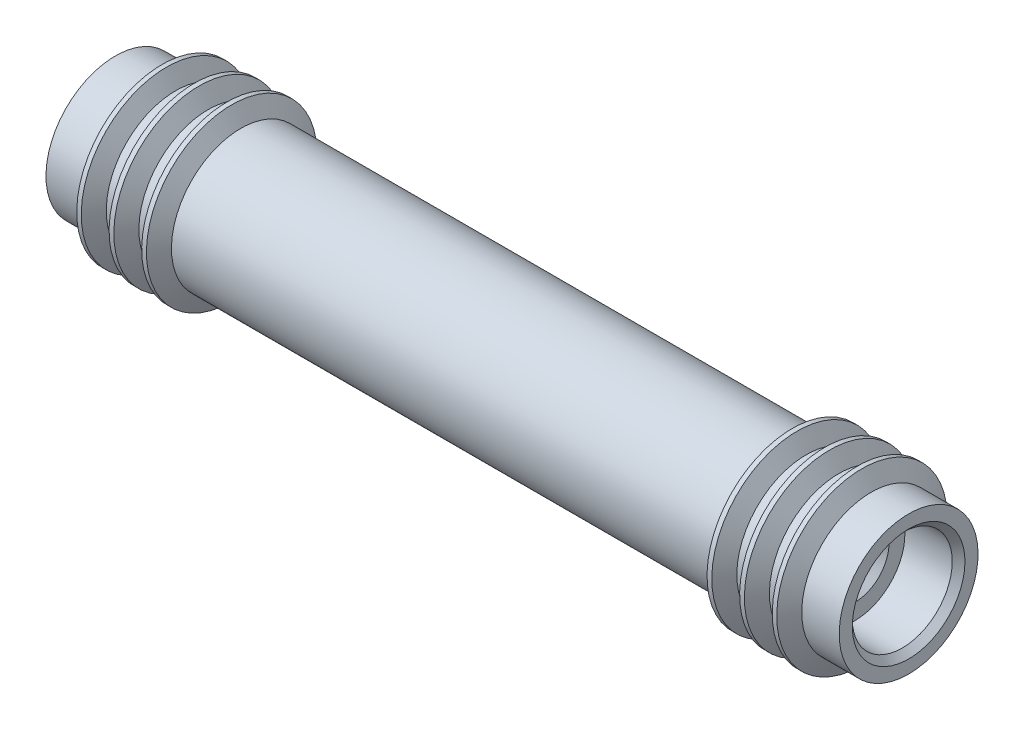
ISO-10303-21;
HEADER;
FILE_DESCRIPTION(('STEP AP214'),'2;1');
FILE_NAME('part.step','',(''),(''),'','','');
FILE_SCHEMA(('AUTOMOTIVE_DESIGN { 1 0 10303 214 1 1 1 1 }'));
ENDSEC;
DATA;
#1=APPLICATION_CONTEXT('core data for automotive mechanical design processes');
#2=APPLICATION_PROTOCOL_DEFINITION('international standard','automotive_design',2000,#1);
#3=PRODUCT_CONTEXT('',#1,'mechanical');
#4=PRODUCT('Part','Part','',(#3));
#5=PRODUCT_RELATED_PRODUCT_CATEGORY('part','',(#4));
#6=PRODUCT_DEFINITION_FORMATION('','',#4);
#7=PRODUCT_DEFINITION_CONTEXT('part definition',#1,'design');
#8=PRODUCT_DEFINITION('design','',#6,#7);
#9=PRODUCT_DEFINITION_SHAPE('','',#8);
#10=(LENGTH_UNIT() NAMED_UNIT(*) SI_UNIT(.MILLI.,.METRE.));
#11=(NAMED_UNIT(*) PLANE_ANGLE_UNIT() SI_UNIT($,.RADIAN.));
#12=(NAMED_UNIT(*) SI_UNIT($,.STERADIAN.) SOLID_ANGLE_UNIT());
#13=UNCERTAINTY_MEASURE_WITH_UNIT(LENGTH_MEASURE(1.E-05),#10,'distance_accuracy_value','');
#14=(GEOMETRIC_REPRESENTATION_CONTEXT(3) GLOBAL_UNCERTAINTY_ASSIGNED_CONTEXT((#13)) GLOBAL_UNIT_ASSIGNED_CONTEXT((#10,
#11,#12)) REPRESENTATION_CONTEXT('',''));
#15=CARTESIAN_POINT('',(0.,0.,0.));
#16=DIRECTION('',(0.,0.,1.));
#17=DIRECTION('',(1.,0.,0.));
#18=AXIS2_PLACEMENT_3D('',#15,#16,#17);
#19=CARTESIAN_POINT('',(-31.75,0.,0.));
#20=DIRECTION('',(-1.,0.,0.));
#21=DIRECTION('',(0.,-1.,0.));
#22=AXIS2_PLACEMENT_3D('',#19,#20,#21);
#23=CYLINDRICAL_SURFACE('',#22,5.55625);
#24=CARTESIAN_POINT('',(-21.7050606325167,0.,0.));
#25=DIRECTION('',(-1.,0.,0.));
#26=DIRECTION('',(0.,-1.,0.));
#27=AXIS2_PLACEMENT_3D('',#24,#25,#26);
#28=CIRCLE('',#27,5.55625);
#29=CARTESIAN_POINT('',(-21.7050606325167,-5.55625,0.));
#30=VERTEX_POINT('',#29);
#31=EDGE_CURVE('E61',#30,#30,#28,.T.);
#32=ORIENTED_EDGE('',*,*,#31,.F.);
#33=EDGE_LOOP('',(#32));
#34=FACE_BOUND('',#33,.T.);
#35=CARTESIAN_POINT('',(21.7050606325167,0.,0.));
#36=DIRECTION('',(-1.,0.,0.));
#37=DIRECTION('',(0.,-1.,0.));
#38=AXIS2_PLACEMENT_3D('',#35,#36,#37);
#39=CIRCLE('',#38,5.55625);
#40=CARTESIAN_POINT('',(21.7050606325167,-5.55625,0.));
#41=VERTEX_POINT('',#40);
#42=EDGE_CURVE('E144',#41,#41,#39,.T.);
#43=ORIENTED_EDGE('',*,*,#42,.T.);
#44=EDGE_LOOP('',(#43));
#45=FACE_BOUND('',#44,.T.);
#46=ADVANCED_FACE('F47',(#34,#45),#23,.T.);
#47=CARTESIAN_POINT('',(-22.4382954743875,0.,0.));
#48=DIRECTION('',(-1.,0.,0.));
#49=DIRECTION('',(0.,-1.,0.));
#50=AXIS2_PLACEMENT_3D('',#47,#48,#49);
#51=CONICAL_SURFACE('',#50,6.82625,1.0471975511966);
#52=ORIENTED_EDGE('',*,*,#31,.T.);
#53=EDGE_LOOP('',(#52));
#54=FACE_BOUND('',#53,.T.);
#55=CARTESIAN_POINT('',(-22.4382954743875,0.,0.));
#56=DIRECTION('',(-1.,0.,0.));
#57=DIRECTION('',(0.,-1.,0.));
#58=AXIS2_PLACEMENT_3D('',#55,#56,#57);
#59=CIRCLE('',#58,6.82625);
#60=CARTESIAN_POINT('',(-22.4382954743875,-6.82625,0.));
#61=VERTEX_POINT('',#60);
#62=EDGE_CURVE('E66',#61,#61,#59,.T.);
#63=ORIENTED_EDGE('',*,*,#62,.F.);
#64=EDGE_LOOP('',(#63));
#65=FACE_BOUND('',#64,.T.);
#66=ADVANCED_FACE('F233',(#54,#65),#51,.T.);
#67=CARTESIAN_POINT('',(-31.75,0.,0.));
#68=DIRECTION('',(-1.,0.,0.));
#69=DIRECTION('',(0.,-1.,0.));
#70=AXIS2_PLACEMENT_3D('',#67,#68,#69);
#71=CYLINDRICAL_SURFACE('',#70,6.82625);
#72=ORIENTED_EDGE('',*,*,#62,.T.);
#73=EDGE_LOOP('',(#72));
#74=FACE_BOUND('',#73,.T.);
#75=CARTESIAN_POINT('',(-22.8192954743875,0.,0.));
#76=DIRECTION('',(-1.,0.,0.));
#77=DIRECTION('',(0.,-1.,0.));
#78=AXIS2_PLACEMENT_3D('',#75,#76,#77);
#79=CIRCLE('',#78,6.82625);
#80=CARTESIAN_POINT('',(-22.8192954743875,-6.82625,0.));
#81=VERTEX_POINT('',#80);
#82=EDGE_CURVE('E72',#81,#81,#79,.T.);
#83=ORIENTED_EDGE('',*,*,#82,.F.);
#84=EDGE_LOOP('',(#83));
#85=FACE_BOUND('',#84,.T.);
#86=ADVANCED_FACE('F240',(#74,#85),#71,.T.);
#87=CARTESIAN_POINT('',(-23.5525303162583,0.,0.));
#88=DIRECTION('',(1.,0.,0.));
#89=DIRECTION('',(0.,1.,0.));
#90=AXIS2_PLACEMENT_3D('',#87,#88,#89);
#91=CONICAL_SURFACE('',#90,5.55625,1.0471975511966);
#92=ORIENTED_EDGE('',*,*,#82,.T.);
#93=EDGE_LOOP('',(#92));
#94=FACE_BOUND('',#93,.T.);
#95=CARTESIAN_POINT('',(-23.5525303162583,0.,0.));
#96=DIRECTION('',(-1.,0.,0.));
#97=DIRECTION('',(0.,-1.,0.));
#98=AXIS2_PLACEMENT_3D('',#95,#96,#97);
#99=CIRCLE('',#98,5.55625);
#100=CARTESIAN_POINT('',(-23.5525303162583,-5.55625,0.));
#101=VERTEX_POINT('',#100);
#102=EDGE_CURVE('E76',#101,#101,#99,.T.);
#103=ORIENTED_EDGE('',*,*,#102,.F.);
#104=EDGE_LOOP('',(#103));
#105=FACE_BOUND('',#104,.T.);
#106=ADVANCED_FACE('F248',(#94,#105),#91,.T.);
#107=CARTESIAN_POINT('',(-31.75,0.,0.));
#108=DIRECTION('',(-1.,0.,0.));
#109=DIRECTION('',(0.,-1.,0.));
#110=AXIS2_PLACEMENT_3D('',#107,#108,#109);
#111=CYLINDRICAL_SURFACE('',#110,5.55625);
#112=ORIENTED_EDGE('',*,*,#102,.T.);
#113=EDGE_LOOP('',(#112));
#114=FACE_BOUND('',#113,.T.);
#115=CARTESIAN_POINT('',(-24.3145303162583,0.,0.));
#116=DIRECTION('',(-1.,0.,0.));
#117=DIRECTION('',(0.,-1.,0.));
#118=AXIS2_PLACEMENT_3D('',#115,#116,#117);
#119=CIRCLE('',#118,5.55625);
#120=CARTESIAN_POINT('',(-24.3145303162583,-5.55625,0.));
#121=VERTEX_POINT('',#120);
#122=EDGE_CURVE('E80',#121,#121,#119,.T.);
#123=ORIENTED_EDGE('',*,*,#122,.F.);
#124=EDGE_LOOP('',(#123));
#125=FACE_BOUND('',#124,.T.);
#126=ADVANCED_FACE('F252',(#114,#125),#111,.T.);
#127=CARTESIAN_POINT('',(-25.0477651581292,0.,0.));
#128=DIRECTION('',(-1.,0.,0.));
#129=DIRECTION('',(0.,-1.,0.));
#130=AXIS2_PLACEMENT_3D('',#127,#128,#129);
#131=CONICAL_SURFACE('',#130,6.82625,1.0471975511966);
#132=ORIENTED_EDGE('',*,*,#122,.T.);
#133=EDGE_LOOP('',(#132));
#134=FACE_BOUND('',#133,.T.);
#135=CARTESIAN_POINT('',(-25.0477651581292,0.,0.));
#136=DIRECTION('',(-1.,0.,0.));
#137=DIRECTION('',(0.,-1.,0.));
#138=AXIS2_PLACEMENT_3D('',#135,#136,#137);
#139=CIRCLE('',#138,6.82625);
#140=CARTESIAN_POINT('',(-25.0477651581292,-6.82625,0.));
#141=VERTEX_POINT('',#140);
#142=EDGE_CURVE('E84',#141,#141,#139,.T.);
#143=ORIENTED_EDGE('',*,*,#142,.F.);
#144=EDGE_LOOP('',(#143));
#145=FACE_BOUND('',#144,.T.);
#146=ADVANCED_FACE('F256',(#134,#145),#131,.T.);
#147=CARTESIAN_POINT('',(-31.75,0.,0.));
#148=DIRECTION('',(-1.,0.,0.));
#149=DIRECTION('',(0.,-1.,0.));
#150=AXIS2_PLACEMENT_3D('',#147,#148,#149);
#151=CYLINDRICAL_SURFACE('',#150,6.82625);
#152=ORIENTED_EDGE('',*,*,#142,.T.);
#153=EDGE_LOOP('',(#152));
#154=FACE_BOUND('',#153,.T.);
#155=CARTESIAN_POINT('',(-25.4287651581292,0.,0.));
#156=DIRECTION('',(-1.,0.,0.));
#157=DIRECTION('',(0.,-1.,0.));
#158=AXIS2_PLACEMENT_3D('',#155,#156,#157);
#159=CIRCLE('',#158,6.82625);
#160=CARTESIAN_POINT('',(-25.4287651581292,-6.82625,0.));
#161=VERTEX_POINT('',#160);
#162=EDGE_CURVE('E88',#161,#161,#159,.T.);
#163=ORIENTED_EDGE('',*,*,#162,.F.);
#164=EDGE_LOOP('',(#163));
#165=FACE_BOUND('',#164,.T.);
#166=ADVANCED_FACE('F260',(#154,#165),#151,.T.);
#167=CARTESIAN_POINT('',(-25.4287651581292,0.,0.));
#168=DIRECTION('',(1.,0.,0.));
#169=DIRECTION('',(0.,1.,0.));
#170=AXIS2_PLACEMENT_3D('',#167,#168,#169);
#171=CONICAL_SURFACE('',#170,6.82625,1.0471975511966);
#172=CARTESIAN_POINT('',(-26.162,0.,0.));
#173=DIRECTION('',(-1.,0.,0.));
#174=DIRECTION('',(0.,-1.,0.));
#175=AXIS2_PLACEMENT_3D('',#172,#173,#174);
#176=CIRCLE('',#175,5.55625);
#177=CARTESIAN_POINT('',(-26.162,-5.55625,0.));
#178=VERTEX_POINT('',#177);
#179=EDGE_CURVE('E92',#178,#178,#176,.T.);
#180=ORIENTED_EDGE('',*,*,#179,.F.);
#181=EDGE_LOOP('',(#180));
#182=FACE_BOUND('',#181,.T.);
#183=ORIENTED_EDGE('',*,*,#162,.T.);
#184=EDGE_LOOP('',(#183));
#185=FACE_BOUND('',#184,.T.);
#186=ADVANCED_FACE('F264',(#182,#185),#171,.T.);
#187=CARTESIAN_POINT('',(-31.75,0.,0.));
#188=DIRECTION('',(-1.,0.,0.));
#189=DIRECTION('',(0.,-1.,0.));
#190=AXIS2_PLACEMENT_3D('',#187,#188,#189);
#191=CYLINDRICAL_SURFACE('',#190,5.55625);
#192=ORIENTED_EDGE('',*,*,#179,.T.);
#193=EDGE_LOOP('',(#192));
#194=FACE_BOUND('',#193,.T.);
#195=CARTESIAN_POINT('',(-26.924,0.,0.));
#196=DIRECTION('',(-1.,0.,0.));
#197=DIRECTION('',(0.,-1.,0.));
#198=AXIS2_PLACEMENT_3D('',#195,#196,#197);
#199=CIRCLE('',#198,5.55625);
#200=CARTESIAN_POINT('',(-26.924,-5.55625,0.));
#201=VERTEX_POINT('',#200);
#202=EDGE_CURVE('E96',#201,#201,#199,.T.);
#203=ORIENTED_EDGE('',*,*,#202,.F.);
#204=EDGE_LOOP('',(#203));
#205=FACE_BOUND('',#204,.T.);
#206=ADVANCED_FACE('F268',(#194,#205),#191,.T.);
#207=CARTESIAN_POINT('',(-27.6572348418708,0.,0.));
#208=DIRECTION('',(-1.,0.,0.));
#209=DIRECTION('',(0.,-1.,0.));
#210=AXIS2_PLACEMENT_3D('',#207,#208,#209);
#211=CONICAL_SURFACE('',#210,6.82625,1.0471975511966);
#212=ORIENTED_EDGE('',*,*,#202,.T.);
#213=EDGE_LOOP('',(#212));
#214=FACE_BOUND('',#213,.T.);
#215=CARTESIAN_POINT('',(-27.6572348418708,0.,0.));
#216=DIRECTION('',(-1.,0.,0.));
#217=DIRECTION('',(0.,-1.,0.));
#218=AXIS2_PLACEMENT_3D('',#215,#216,#217);
#219=CIRCLE('',#218,6.82625);
#220=CARTESIAN_POINT('',(-27.6572348418708,-6.82625,0.));
#221=VERTEX_POINT('',#220);
#222=EDGE_CURVE('E100',#221,#221,#219,.T.);
#223=ORIENTED_EDGE('',*,*,#222,.F.);
#224=EDGE_LOOP('',(#223));
#225=FACE_BOUND('',#224,.T.);
#226=ADVANCED_FACE('F272',(#214,#225),#211,.T.);
#227=CARTESIAN_POINT('',(-31.75,0.,0.));
#228=DIRECTION('',(-1.,0.,0.));
#229=DIRECTION('',(0.,-1.,0.));
#230=AXIS2_PLACEMENT_3D('',#227,#228,#229);
#231=CYLINDRICAL_SURFACE('',#230,6.82625);
#232=ORIENTED_EDGE('',*,*,#222,.T.);
#233=EDGE_LOOP('',(#232));
#234=FACE_BOUND('',#233,.T.);
#235=CARTESIAN_POINT('',(-28.0167651581292,0.,0.));
#236=DIRECTION('',(-1.,0.,0.));
#237=DIRECTION('',(0.,-1.,0.));
#238=AXIS2_PLACEMENT_3D('',#235,#236,#237);
#239=CIRCLE('',#238,6.82625);
#240=CARTESIAN_POINT('',(-28.0167651581292,-6.82625,0.));
#241=VERTEX_POINT('',#240);
#242=EDGE_CURVE('E104',#241,#241,#239,.T.);
#243=ORIENTED_EDGE('',*,*,#242,.F.);
#244=EDGE_LOOP('',(#243));
#245=FACE_BOUND('',#244,.T.);
#246=ADVANCED_FACE('F276',(#234,#245),#231,.T.);
#247=CARTESIAN_POINT('',(-28.75,0.,0.));
#248=DIRECTION('',(1.,0.,0.));
#249=DIRECTION('',(0.,1.,0.));
#250=AXIS2_PLACEMENT_3D('',#247,#248,#249);
#251=CONICAL_SURFACE('',#250,5.55625,1.0471975511966);
#252=ORIENTED_EDGE('',*,*,#242,.T.);
#253=EDGE_LOOP('',(#252));
#254=FACE_BOUND('',#253,.T.);
#255=CARTESIAN_POINT('',(-28.75,0.,0.));
#256=DIRECTION('',(-1.,0.,0.));
#257=DIRECTION('',(0.,-1.,0.));
#258=AXIS2_PLACEMENT_3D('',#255,#256,#257);
#259=CIRCLE('',#258,5.55625);
#260=CARTESIAN_POINT('',(-28.75,-5.55625,0.));
#261=VERTEX_POINT('',#260);
#262=EDGE_CURVE('E108',#261,#261,#259,.T.);
#263=ORIENTED_EDGE('',*,*,#262,.F.);
#264=EDGE_LOOP('',(#263));
#265=FACE_BOUND('',#264,.T.);
#266=ADVANCED_FACE('F280',(#254,#265),#251,.T.);
#267=CARTESIAN_POINT('',(-31.75,0.,0.));
#268=DIRECTION('',(-1.,0.,0.));
#269=DIRECTION('',(0.,-1.,0.));
#270=AXIS2_PLACEMENT_3D('',#267,#268,#269);
#271=CYLINDRICAL_SURFACE('',#270,5.55625);
#272=ORIENTED_EDGE('',*,*,#262,.T.);
#273=EDGE_LOOP('',(#272));
#274=FACE_BOUND('',#273,.T.);
#275=CARTESIAN_POINT('',(-31.75,0.,0.));
#276=DIRECTION('',(-1.,0.,0.));
#277=DIRECTION('',(0.,-1.,0.));
#278=AXIS2_PLACEMENT_3D('',#275,#276,#277);
#279=CIRCLE('',#278,5.55625);
#280=CARTESIAN_POINT('',(-31.75,-5.55625,0.));
#281=VERTEX_POINT('',#280);
#282=EDGE_CURVE('E112',#281,#281,#279,.T.);
#283=ORIENTED_EDGE('',*,*,#282,.F.);
#284=EDGE_LOOP('',(#283));
#285=FACE_BOUND('',#284,.T.);
#286=ADVANCED_FACE('F284',(#274,#285),#271,.T.);
#287=CARTESIAN_POINT('',(-31.75,0.,0.));
#288=DIRECTION('',(1.,0.,0.));
#289=DIRECTION('',(0.,1.,0.));
#290=AXIS2_PLACEMENT_3D('',#287,#288,#289);
#291=PLANE('',#290);
#292=CARTESIAN_POINT('',(-31.75,0.,0.));
#293=DIRECTION('',(1.,0.,0.));
#294=DIRECTION('',(0.,1.,0.));
#295=AXIS2_PLACEMENT_3D('',#292,#293,#294);
#296=CIRCLE('',#295,4.50800000000001);
#297=CARTESIAN_POINT('',(-31.75,4.50800000000001,0.));
#298=VERTEX_POINT('',#297);
#299=EDGE_CURVE('E10',#298,#298,#296,.T.);
#300=ORIENTED_EDGE('',*,*,#299,.T.);
#301=EDGE_LOOP('',(#300));
#302=FACE_BOUND('',#301,.T.);
#303=ORIENTED_EDGE('',*,*,#282,.T.);
#304=EDGE_LOOP('',(#303));
#305=FACE_BOUND('',#304,.T.);
#306=ADVANCED_FACE('F288',(#302,#305),#291,.F.);
#307=CARTESIAN_POINT('',(-31.75,0.,0.));
#308=DIRECTION('',(-1.,0.,0.));
#309=DIRECTION('',(0.,-1.,0.));
#310=AXIS2_PLACEMENT_3D('',#307,#308,#309);
#311=CYLINDRICAL_SURFACE('',#310,4.);
#312=CARTESIAN_POINT('',(-31.242,0.,0.));
#313=DIRECTION('',(1.,0.,0.));
#314=DIRECTION('',(0.,1.,0.));
#315=AXIS2_PLACEMENT_3D('',#312,#313,#314);
#316=CIRCLE('',#315,4.);
#317=CARTESIAN_POINT('',(-31.242,4.,0.));
#318=VERTEX_POINT('',#317);
#319=EDGE_CURVE('E56',#318,#318,#316,.F.);
#320=ORIENTED_EDGE('',*,*,#319,.T.);
#321=EDGE_LOOP('',(#320));
#322=FACE_BOUND('',#321,.T.);
#323=CARTESIAN_POINT('',(-27.45,0.,0.));
#324=DIRECTION('',(-1.,0.,0.));
#325=DIRECTION('',(0.,-1.,0.));
#326=AXIS2_PLACEMENT_3D('',#323,#324,#325);
#327=CIRCLE('',#326,4.);
#328=CARTESIAN_POINT('',(-27.45,-4.,0.));
#329=VERTEX_POINT('',#328);
#330=EDGE_CURVE('E116',#329,#329,#327,.T.);
#331=ORIENTED_EDGE('',*,*,#330,.F.);
#332=EDGE_LOOP('',(#331));
#333=FACE_BOUND('',#332,.T.);
#334=ADVANCED_FACE('F292',(#322,#333),#311,.F.);
#335=CARTESIAN_POINT('',(-27.45,0.,0.));
#336=DIRECTION('',(1.,0.,0.));
#337=DIRECTION('',(0.,1.,0.));
#338=AXIS2_PLACEMENT_3D('',#335,#336,#337);
#339=PLANE('',#338);
#340=CARTESIAN_POINT('',(-27.45,0.,0.));
#341=DIRECTION('',(-1.,0.,0.));
#342=DIRECTION('',(0.,-1.,0.));
#343=AXIS2_PLACEMENT_3D('',#340,#341,#342);
#344=CIRCLE('',#343,2.73);
#345=CARTESIAN_POINT('',(-27.45,-2.73,0.));
#346=VERTEX_POINT('',#345);
#347=EDGE_CURVE('E120',#346,#346,#344,.T.);
#348=ORIENTED_EDGE('',*,*,#347,.F.);
#349=EDGE_LOOP('',(#348));
#350=FACE_BOUND('',#349,.T.);
#351=ORIENTED_EDGE('',*,*,#330,.T.);
#352=EDGE_LOOP('',(#351));
#353=FACE_BOUND('',#352,.T.);
#354=ADVANCED_FACE('F295',(#350,#353),#339,.F.);
#355=CARTESIAN_POINT('',(-27.45,0.,0.));
#356=DIRECTION('',(-1.,0.,0.));
#357=DIRECTION('',(0.,-1.,0.));
#358=AXIS2_PLACEMENT_3D('',#355,#356,#357);
#359=CONICAL_SURFACE('',#358,2.73,0.785398163397452);
#360=CARTESIAN_POINT('',(-26.942,0.,0.));
#361=DIRECTION('',(-1.,0.,0.));
#362=DIRECTION('',(0.,-1.,0.));
#363=AXIS2_PLACEMENT_3D('',#360,#361,#362);
#364=CIRCLE('',#363,2.222);
#365=CARTESIAN_POINT('',(-26.942,-2.222,0.));
#366=VERTEX_POINT('',#365);
#367=EDGE_CURVE('E124',#366,#366,#364,.T.);
#368=ORIENTED_EDGE('',*,*,#367,.F.);
#369=EDGE_LOOP('',(#368));
#370=FACE_BOUND('',#369,.T.);
#371=ORIENTED_EDGE('',*,*,#347,.T.);
#372=EDGE_LOOP('',(#371));
#373=FACE_BOUND('',#372,.T.);
#374=ADVANCED_FACE('F298',(#370,#373),#359,.F.);
#375=CARTESIAN_POINT('',(-26.942,0.,0.));
#376=DIRECTION('',(1.,0.,0.));
#377=DIRECTION('',(0.,1.,0.));
#378=AXIS2_PLACEMENT_3D('',#375,#376,#377);
#379=PLANE('',#378);
#380=CARTESIAN_POINT('',(-26.942,0.,0.));
#381=DIRECTION('',(-1.,0.,0.));
#382=DIRECTION('',(0.,-1.,0.));
#383=AXIS2_PLACEMENT_3D('',#380,#381,#382);
#384=CIRCLE('',#383,1.7145);
#385=CARTESIAN_POINT('',(-26.942,-1.7145,0.));
#386=VERTEX_POINT('',#385);
#387=EDGE_CURVE('E128',#386,#386,#384,.T.);
#388=ORIENTED_EDGE('',*,*,#387,.F.);
#389=EDGE_LOOP('',(#388));
#390=FACE_BOUND('',#389,.T.);
#391=ORIENTED_EDGE('',*,*,#367,.T.);
#392=EDGE_LOOP('',(#391));
#393=FACE_BOUND('',#392,.T.);
#394=ADVANCED_FACE('F302',(#390,#393),#379,.F.);
#395=CARTESIAN_POINT('',(-31.75,0.,0.));
#396=DIRECTION('',(-1.,0.,0.));
#397=DIRECTION('',(0.,-1.,0.));
#398=AXIS2_PLACEMENT_3D('',#395,#396,#397);
#399=CYLINDRICAL_SURFACE('',#398,1.7145);
#400=CARTESIAN_POINT('',(-21.925,0.,0.));
#401=DIRECTION('',(-1.,0.,0.));
#402=DIRECTION('',(0.,-1.,0.));
#403=AXIS2_PLACEMENT_3D('',#400,#401,#402);
#404=CIRCLE('',#403,1.7145);
#405=CARTESIAN_POINT('',(-21.925,-1.7145,0.));
#406=VERTEX_POINT('',#405);
#407=EDGE_CURVE('E132',#406,#406,#404,.T.);
#408=ORIENTED_EDGE('',*,*,#407,.F.);
#409=EDGE_LOOP('',(#408));
#410=FACE_BOUND('',#409,.T.);
#411=ORIENTED_EDGE('',*,*,#387,.T.);
#412=EDGE_LOOP('',(#411));
#413=FACE_BOUND('',#412,.T.);
#414=ADVANCED_FACE('F306',(#410,#413),#399,.F.);
#415=CARTESIAN_POINT('',(-21.925,0.,0.));
#416=DIRECTION('',(1.,0.,0.));
#417=DIRECTION('',(0.,1.,0.));
#418=AXIS2_PLACEMENT_3D('',#415,#416,#417);
#419=PLANE('',#418);
#420=ORIENTED_EDGE('',*,*,#407,.T.);
#421=EDGE_LOOP('',(#420));
#422=FACE_BOUND('',#421,.T.);
#423=ADVANCED_FACE('F310',(#422),#419,.F.);
#424=CARTESIAN_POINT('',(-31.242,0.,0.));
#425=DIRECTION('',(-1.,0.,0.));
#426=DIRECTION('',(0.,-1.,0.));
#427=AXIS2_PLACEMENT_3D('',#424,#425,#426);
#428=CONICAL_SURFACE('',#427,4.,0.785398163397448);
#429=ORIENTED_EDGE('',*,*,#299,.F.);
#430=EDGE_LOOP('',(#429));
#431=FACE_BOUND('',#430,.T.);
#432=ORIENTED_EDGE('',*,*,#319,.F.);
#433=EDGE_LOOP('',(#432));
#434=FACE_BOUND('',#433,.T.);
#435=ADVANCED_FACE('F50',(#431,#434),#428,.F.);
#436=CARTESIAN_POINT('',(22.4382954743875,0.,0.));
#437=DIRECTION('',(1.,0.,0.));
#438=DIRECTION('',(0.,-1.,0.));
#439=AXIS2_PLACEMENT_3D('',#436,#437,#438);
#440=CONICAL_SURFACE('',#439,6.82625,1.0471975511966);
#441=ORIENTED_EDGE('',*,*,#42,.F.);
#442=EDGE_LOOP('',(#441));
#443=FACE_BOUND('',#442,.T.);
#444=CARTESIAN_POINT('',(22.4382954743875,0.,0.));
#445=DIRECTION('',(-1.,0.,0.));
#446=DIRECTION('',(0.,-1.,0.));
#447=AXIS2_PLACEMENT_3D('',#444,#445,#446);
#448=CIRCLE('',#447,6.82625);
#449=CARTESIAN_POINT('',(22.4382954743875,-6.82625,0.));
#450=VERTEX_POINT('',#449);
#451=EDGE_CURVE('E148',#450,#450,#448,.T.);
#452=ORIENTED_EDGE('',*,*,#451,.T.);
#453=EDGE_LOOP('',(#452));
#454=FACE_BOUND('',#453,.T.);
#455=ADVANCED_FACE('F315',(#443,#454),#440,.T.);
#456=CARTESIAN_POINT('',(31.75,0.,0.));
#457=DIRECTION('',(1.,0.,0.));
#458=DIRECTION('',(0.,-1.,0.));
#459=AXIS2_PLACEMENT_3D('',#456,#457,#458);
#460=CYLINDRICAL_SURFACE('',#459,6.82625);
#461=ORIENTED_EDGE('',*,*,#451,.F.);
#462=EDGE_LOOP('',(#461));
#463=FACE_BOUND('',#462,.T.);
#464=CARTESIAN_POINT('',(22.8192954743875,0.,0.));
#465=DIRECTION('',(-1.,0.,0.));
#466=DIRECTION('',(0.,-1.,0.));
#467=AXIS2_PLACEMENT_3D('',#464,#465,#466);
#468=CIRCLE('',#467,6.82625);
#469=CARTESIAN_POINT('',(22.8192954743875,-6.82625,0.));
#470=VERTEX_POINT('',#469);
#471=EDGE_CURVE('E152',#470,#470,#468,.T.);
#472=ORIENTED_EDGE('',*,*,#471,.T.);
#473=EDGE_LOOP('',(#472));
#474=FACE_BOUND('',#473,.T.);
#475=ADVANCED_FACE('F317',(#463,#474),#460,.T.);
#476=CARTESIAN_POINT('',(23.5525303162583,0.,0.));
#477=DIRECTION('',(-1.,0.,0.));
#478=DIRECTION('',(0.,1.,0.));
#479=AXIS2_PLACEMENT_3D('',#476,#477,#478);
#480=CONICAL_SURFACE('',#479,5.55625,1.0471975511966);
#481=ORIENTED_EDGE('',*,*,#471,.F.);
#482=EDGE_LOOP('',(#481));
#483=FACE_BOUND('',#482,.T.);
#484=CARTESIAN_POINT('',(23.5525303162583,0.,0.));
#485=DIRECTION('',(-1.,0.,0.));
#486=DIRECTION('',(0.,-1.,0.));
#487=AXIS2_PLACEMENT_3D('',#484,#485,#486);
#488=CIRCLE('',#487,5.55625);
#489=CARTESIAN_POINT('',(23.5525303162583,-5.55625,0.));
#490=VERTEX_POINT('',#489);
#491=EDGE_CURVE('E156',#490,#490,#488,.T.);
#492=ORIENTED_EDGE('',*,*,#491,.T.);
#493=EDGE_LOOP('',(#492));
#494=FACE_BOUND('',#493,.T.);
#495=ADVANCED_FACE('F321',(#483,#494),#480,.T.);
#496=CARTESIAN_POINT('',(31.75,0.,0.));
#497=DIRECTION('',(1.,0.,0.));
#498=DIRECTION('',(0.,-1.,0.));
#499=AXIS2_PLACEMENT_3D('',#496,#497,#498);
#500=CYLINDRICAL_SURFACE('',#499,5.55625);
#501=ORIENTED_EDGE('',*,*,#491,.F.);
#502=EDGE_LOOP('',(#501));
#503=FACE_BOUND('',#502,.T.);
#504=CARTESIAN_POINT('',(24.3145303162583,0.,0.));
#505=DIRECTION('',(-1.,0.,0.));
#506=DIRECTION('',(0.,-1.,0.));
#507=AXIS2_PLACEMENT_3D('',#504,#505,#506);
#508=CIRCLE('',#507,5.55625);
#509=CARTESIAN_POINT('',(24.3145303162583,-5.55625,0.));
#510=VERTEX_POINT('',#509);
#511=EDGE_CURVE('E160',#510,#510,#508,.T.);
#512=ORIENTED_EDGE('',*,*,#511,.T.);
#513=EDGE_LOOP('',(#512));
#514=FACE_BOUND('',#513,.T.);
#515=ADVANCED_FACE('F325',(#503,#514),#500,.T.);
#516=CARTESIAN_POINT('',(25.0477651581292,0.,0.));
#517=DIRECTION('',(1.,0.,0.));
#518=DIRECTION('',(0.,-1.,0.));
#519=AXIS2_PLACEMENT_3D('',#516,#517,#518);
#520=CONICAL_SURFACE('',#519,6.82625,1.0471975511966);
#521=ORIENTED_EDGE('',*,*,#511,.F.);
#522=EDGE_LOOP('',(#521));
#523=FACE_BOUND('',#522,.T.);
#524=CARTESIAN_POINT('',(25.0477651581292,0.,0.));
#525=DIRECTION('',(-1.,0.,0.));
#526=DIRECTION('',(0.,-1.,0.));
#527=AXIS2_PLACEMENT_3D('',#524,#525,#526);
#528=CIRCLE('',#527,6.82625);
#529=CARTESIAN_POINT('',(25.0477651581292,-6.82625,0.));
#530=VERTEX_POINT('',#529);
#531=EDGE_CURVE('E164',#530,#530,#528,.T.);
#532=ORIENTED_EDGE('',*,*,#531,.T.);
#533=EDGE_LOOP('',(#532));
#534=FACE_BOUND('',#533,.T.);
#535=ADVANCED_FACE('F329',(#523,#534),#520,.T.);
#536=CARTESIAN_POINT('',(31.75,0.,0.));
#537=DIRECTION('',(1.,0.,0.));
#538=DIRECTION('',(0.,-1.,0.));
#539=AXIS2_PLACEMENT_3D('',#536,#537,#538);
#540=CYLINDRICAL_SURFACE('',#539,6.82625);
#541=ORIENTED_EDGE('',*,*,#531,.F.);
#542=EDGE_LOOP('',(#541));
#543=FACE_BOUND('',#542,.T.);
#544=CARTESIAN_POINT('',(25.4287651581292,0.,0.));
#545=DIRECTION('',(-1.,0.,0.));
#546=DIRECTION('',(0.,-1.,0.));
#547=AXIS2_PLACEMENT_3D('',#544,#545,#546);
#548=CIRCLE('',#547,6.82625);
#549=CARTESIAN_POINT('',(25.4287651581292,-6.82625,0.));
#550=VERTEX_POINT('',#549);
#551=EDGE_CURVE('E168',#550,#550,#548,.T.);
#552=ORIENTED_EDGE('',*,*,#551,.T.);
#553=EDGE_LOOP('',(#552));
#554=FACE_BOUND('',#553,.T.);
#555=ADVANCED_FACE('F333',(#543,#554),#540,.T.);
#556=CARTESIAN_POINT('',(25.4287651581292,0.,0.));
#557=DIRECTION('',(-1.,0.,0.));
#558=DIRECTION('',(0.,1.,0.));
#559=AXIS2_PLACEMENT_3D('',#556,#557,#558);
#560=CONICAL_SURFACE('',#559,6.82625,1.0471975511966);
#561=CARTESIAN_POINT('',(26.162,0.,0.));
#562=DIRECTION('',(-1.,0.,0.));
#563=DIRECTION('',(0.,-1.,0.));
#564=AXIS2_PLACEMENT_3D('',#561,#562,#563);
#565=CIRCLE('',#564,5.55625);
#566=CARTESIAN_POINT('',(26.162,-5.55625,0.));
#567=VERTEX_POINT('',#566);
#568=EDGE_CURVE('E172',#567,#567,#565,.T.);
#569=ORIENTED_EDGE('',*,*,#568,.T.);
#570=EDGE_LOOP('',(#569));
#571=FACE_BOUND('',#570,.T.);
#572=ORIENTED_EDGE('',*,*,#551,.F.);
#573=EDGE_LOOP('',(#572));
#574=FACE_BOUND('',#573,.T.);
#575=ADVANCED_FACE('F337',(#571,#574),#560,.T.);
#576=CARTESIAN_POINT('',(31.75,0.,0.));
#577=DIRECTION('',(1.,0.,0.));
#578=DIRECTION('',(0.,-1.,0.));
#579=AXIS2_PLACEMENT_3D('',#576,#577,#578);
#580=CYLINDRICAL_SURFACE('',#579,5.55625);
#581=ORIENTED_EDGE('',*,*,#568,.F.);
#582=EDGE_LOOP('',(#581));
#583=FACE_BOUND('',#582,.T.);
#584=CARTESIAN_POINT('',(26.924,0.,0.));
#585=DIRECTION('',(-1.,0.,0.));
#586=DIRECTION('',(0.,-1.,0.));
#587=AXIS2_PLACEMENT_3D('',#584,#585,#586);
#588=CIRCLE('',#587,5.55625);
#589=CARTESIAN_POINT('',(26.924,-5.55625,0.));
#590=VERTEX_POINT('',#589);
#591=EDGE_CURVE('E176',#590,#590,#588,.T.);
#592=ORIENTED_EDGE('',*,*,#591,.T.);
#593=EDGE_LOOP('',(#592));
#594=FACE_BOUND('',#593,.T.);
#595=ADVANCED_FACE('F341',(#583,#594),#580,.T.);
#596=CARTESIAN_POINT('',(27.6572348418708,0.,0.));
#597=DIRECTION('',(1.,0.,0.));
#598=DIRECTION('',(0.,-1.,0.));
#599=AXIS2_PLACEMENT_3D('',#596,#597,#598);
#600=CONICAL_SURFACE('',#599,6.82625,1.0471975511966);
#601=ORIENTED_EDGE('',*,*,#591,.F.);
#602=EDGE_LOOP('',(#601));
#603=FACE_BOUND('',#602,.T.);
#604=CARTESIAN_POINT('',(27.6572348418708,0.,0.));
#605=DIRECTION('',(-1.,0.,0.));
#606=DIRECTION('',(0.,-1.,0.));
#607=AXIS2_PLACEMENT_3D('',#604,#605,#606);
#608=CIRCLE('',#607,6.82625);
#609=CARTESIAN_POINT('',(27.6572348418708,-6.82625,0.));
#610=VERTEX_POINT('',#609);
#611=EDGE_CURVE('E180',#610,#610,#608,.T.);
#612=ORIENTED_EDGE('',*,*,#611,.T.);
#613=EDGE_LOOP('',(#612));
#614=FACE_BOUND('',#613,.T.);
#615=ADVANCED_FACE('F345',(#603,#614),#600,.T.);
#616=CARTESIAN_POINT('',(31.75,0.,0.));
#617=DIRECTION('',(1.,0.,0.));
#618=DIRECTION('',(0.,-1.,0.));
#619=AXIS2_PLACEMENT_3D('',#616,#617,#618);
#620=CYLINDRICAL_SURFACE('',#619,6.82625);
#621=ORIENTED_EDGE('',*,*,#611,.F.);
#622=EDGE_LOOP('',(#621));
#623=FACE_BOUND('',#622,.T.);
#624=CARTESIAN_POINT('',(28.0167651581292,0.,0.));
#625=DIRECTION('',(-1.,0.,0.));
#626=DIRECTION('',(0.,-1.,0.));
#627=AXIS2_PLACEMENT_3D('',#624,#625,#626);
#628=CIRCLE('',#627,6.82625);
#629=CARTESIAN_POINT('',(28.0167651581292,-6.82625,0.));
#630=VERTEX_POINT('',#629);
#631=EDGE_CURVE('E184',#630,#630,#628,.T.);
#632=ORIENTED_EDGE('',*,*,#631,.T.);
#633=EDGE_LOOP('',(#632));
#634=FACE_BOUND('',#633,.T.);
#635=ADVANCED_FACE('F349',(#623,#634),#620,.T.);
#636=CARTESIAN_POINT('',(28.75,0.,0.));
#637=DIRECTION('',(-1.,0.,0.));
#638=DIRECTION('',(0.,1.,0.));
#639=AXIS2_PLACEMENT_3D('',#636,#637,#638);
#640=CONICAL_SURFACE('',#639,5.55625,1.0471975511966);
#641=ORIENTED_EDGE('',*,*,#631,.F.);
#642=EDGE_LOOP('',(#641));
#643=FACE_BOUND('',#642,.T.);
#644=CARTESIAN_POINT('',(28.75,0.,0.));
#645=DIRECTION('',(-1.,0.,0.));
#646=DIRECTION('',(0.,-1.,0.));
#647=AXIS2_PLACEMENT_3D('',#644,#645,#646);
#648=CIRCLE('',#647,5.55625);
#649=CARTESIAN_POINT('',(28.75,-5.55625,0.));
#650=VERTEX_POINT('',#649);
#651=EDGE_CURVE('E188',#650,#650,#648,.T.);
#652=ORIENTED_EDGE('',*,*,#651,.T.);
#653=EDGE_LOOP('',(#652));
#654=FACE_BOUND('',#653,.T.);
#655=ADVANCED_FACE('F353',(#643,#654),#640,.T.);
#656=CARTESIAN_POINT('',(31.75,0.,0.));
#657=DIRECTION('',(1.,0.,0.));
#658=DIRECTION('',(0.,-1.,0.));
#659=AXIS2_PLACEMENT_3D('',#656,#657,#658);
#660=CYLINDRICAL_SURFACE('',#659,5.55625);
#661=ORIENTED_EDGE('',*,*,#651,.F.);
#662=EDGE_LOOP('',(#661));
#663=FACE_BOUND('',#662,.T.);
#664=CARTESIAN_POINT('',(31.75,0.,0.));
#665=DIRECTION('',(-1.,0.,0.));
#666=DIRECTION('',(0.,-1.,0.));
#667=AXIS2_PLACEMENT_3D('',#664,#665,#666);
#668=CIRCLE('',#667,5.55625);
#669=CARTESIAN_POINT('',(31.75,-5.55625,0.));
#670=VERTEX_POINT('',#669);
#671=EDGE_CURVE('E192',#670,#670,#668,.T.);
#672=ORIENTED_EDGE('',*,*,#671,.T.);
#673=EDGE_LOOP('',(#672));
#674=FACE_BOUND('',#673,.T.);
#675=ADVANCED_FACE('F357',(#663,#674),#660,.T.);
#676=CARTESIAN_POINT('',(31.75,0.,0.));
#677=DIRECTION('',(-1.,0.,0.));
#678=DIRECTION('',(0.,1.,0.));
#679=AXIS2_PLACEMENT_3D('',#676,#677,#678);
#680=PLANE('',#679);
#681=CARTESIAN_POINT('',(31.75,0.,0.));
#682=DIRECTION('',(1.,0.,0.));
#683=DIRECTION('',(0.,1.,0.));
#684=AXIS2_PLACEMENT_3D('',#681,#682,#683);
#685=CIRCLE('',#684,4.50800000000001);
#686=CARTESIAN_POINT('',(31.75,4.50800000000001,0.));
#687=VERTEX_POINT('',#686);
#688=EDGE_CURVE('E136',#687,#687,#685,.T.);
#689=ORIENTED_EDGE('',*,*,#688,.F.);
#690=EDGE_LOOP('',(#689));
#691=FACE_BOUND('',#690,.T.);
#692=ORIENTED_EDGE('',*,*,#671,.F.);
#693=EDGE_LOOP('',(#692));
#694=FACE_BOUND('',#693,.T.);
#695=ADVANCED_FACE('F361',(#691,#694),#680,.F.);
#696=CARTESIAN_POINT('',(31.75,0.,0.));
#697=DIRECTION('',(1.,0.,0.));
#698=DIRECTION('',(0.,-1.,0.));
#699=AXIS2_PLACEMENT_3D('',#696,#697,#698);
#700=CYLINDRICAL_SURFACE('',#699,4.);
#701=CARTESIAN_POINT('',(31.242,0.,0.));
#702=DIRECTION('',(1.,0.,0.));
#703=DIRECTION('',(0.,1.,0.));
#704=AXIS2_PLACEMENT_3D('',#701,#702,#703);
#705=CIRCLE('',#704,4.);
#706=CARTESIAN_POINT('',(31.242,4.,0.));
#707=VERTEX_POINT('',#706);
#708=EDGE_CURVE('E140',#707,#707,#705,.F.);
#709=ORIENTED_EDGE('',*,*,#708,.F.);
#710=EDGE_LOOP('',(#709));
#711=FACE_BOUND('',#710,.T.);
#712=CARTESIAN_POINT('',(27.45,0.,0.));
#713=DIRECTION('',(-1.,0.,0.));
#714=DIRECTION('',(0.,-1.,0.));
#715=AXIS2_PLACEMENT_3D('',#712,#713,#714);
#716=CIRCLE('',#715,4.);
#717=CARTESIAN_POINT('',(27.45,-4.,0.));
#718=VERTEX_POINT('',#717);
#719=EDGE_CURVE('E196',#718,#718,#716,.T.);
#720=ORIENTED_EDGE('',*,*,#719,.T.);
#721=EDGE_LOOP('',(#720));
#722=FACE_BOUND('',#721,.T.);
#723=ADVANCED_FACE('F365',(#711,#722),#700,.F.);
#724=CARTESIAN_POINT('',(27.45,0.,0.));
#725=DIRECTION('',(-1.,0.,0.));
#726=DIRECTION('',(0.,1.,0.));
#727=AXIS2_PLACEMENT_3D('',#724,#725,#726);
#728=PLANE('',#727);
#729=CARTESIAN_POINT('',(27.45,0.,0.));
#730=DIRECTION('',(-1.,0.,0.));
#731=DIRECTION('',(0.,-1.,0.));
#732=AXIS2_PLACEMENT_3D('',#729,#730,#731);
#733=CIRCLE('',#732,2.73);
#734=CARTESIAN_POINT('',(27.45,-2.73,0.));
#735=VERTEX_POINT('',#734);
#736=EDGE_CURVE('E200',#735,#735,#733,.T.);
#737=ORIENTED_EDGE('',*,*,#736,.T.);
#738=EDGE_LOOP('',(#737));
#739=FACE_BOUND('',#738,.T.);
#740=ORIENTED_EDGE('',*,*,#719,.F.);
#741=EDGE_LOOP('',(#740));
#742=FACE_BOUND('',#741,.T.);
#743=ADVANCED_FACE('F369',(#739,#742),#728,.F.);
#744=CARTESIAN_POINT('',(27.45,0.,0.));
#745=DIRECTION('',(1.,0.,0.));
#746=DIRECTION('',(0.,-1.,0.));
#747=AXIS2_PLACEMENT_3D('',#744,#745,#746);
#748=CONICAL_SURFACE('',#747,2.73,0.785398163397452);
#749=CARTESIAN_POINT('',(26.942,0.,0.));
#750=DIRECTION('',(-1.,0.,0.));
#751=DIRECTION('',(0.,-1.,0.));
#752=AXIS2_PLACEMENT_3D('',#749,#750,#751);
#753=CIRCLE('',#752,2.222);
#754=CARTESIAN_POINT('',(26.942,-2.222,0.));
#755=VERTEX_POINT('',#754);
#756=EDGE_CURVE('E204',#755,#755,#753,.T.);
#757=ORIENTED_EDGE('',*,*,#756,.T.);
#758=EDGE_LOOP('',(#757));
#759=FACE_BOUND('',#758,.T.);
#760=ORIENTED_EDGE('',*,*,#736,.F.);
#761=EDGE_LOOP('',(#760));
#762=FACE_BOUND('',#761,.T.);
#763=ADVANCED_FACE('F373',(#759,#762),#748,.F.);
#764=CARTESIAN_POINT('',(26.942,0.,0.));
#765=DIRECTION('',(-1.,0.,0.));
#766=DIRECTION('',(0.,1.,0.));
#767=AXIS2_PLACEMENT_3D('',#764,#765,#766);
#768=PLANE('',#767);
#769=CARTESIAN_POINT('',(26.942,0.,0.));
#770=DIRECTION('',(-1.,0.,0.));
#771=DIRECTION('',(0.,-1.,0.));
#772=AXIS2_PLACEMENT_3D('',#769,#770,#771);
#773=CIRCLE('',#772,1.7145);
#774=CARTESIAN_POINT('',(26.942,-1.7145,0.));
#775=VERTEX_POINT('',#774);
#776=EDGE_CURVE('E208',#775,#775,#773,.T.);
#777=ORIENTED_EDGE('',*,*,#776,.T.);
#778=EDGE_LOOP('',(#777));
#779=FACE_BOUND('',#778,.T.);
#780=ORIENTED_EDGE('',*,*,#756,.F.);
#781=EDGE_LOOP('',(#780));
#782=FACE_BOUND('',#781,.T.);
#783=ADVANCED_FACE('F230',(#779,#782),#768,.F.);
#784=CARTESIAN_POINT('',(31.75,0.,0.));
#785=DIRECTION('',(1.,0.,0.));
#786=DIRECTION('',(0.,-1.,0.));
#787=AXIS2_PLACEMENT_3D('',#784,#785,#786);
#788=CYLINDRICAL_SURFACE('',#787,1.7145);
#789=CARTESIAN_POINT('',(21.925,0.,0.));
#790=DIRECTION('',(-1.,0.,0.));
#791=DIRECTION('',(0.,-1.,0.));
#792=AXIS2_PLACEMENT_3D('',#789,#790,#791);
#793=CIRCLE('',#792,1.7145);
#794=CARTESIAN_POINT('',(21.925,-1.7145,0.));
#795=VERTEX_POINT('',#794);
#796=EDGE_CURVE('E212',#795,#795,#793,.T.);
#797=ORIENTED_EDGE('',*,*,#796,.T.);
#798=EDGE_LOOP('',(#797));
#799=FACE_BOUND('',#798,.T.);
#800=ORIENTED_EDGE('',*,*,#776,.F.);
#801=EDGE_LOOP('',(#800));
#802=FACE_BOUND('',#801,.T.);
#803=ADVANCED_FACE('F217',(#799,#802),#788,.F.);
#804=CARTESIAN_POINT('',(21.925,0.,0.));
#805=DIRECTION('',(-1.,0.,0.));
#806=DIRECTION('',(0.,1.,0.));
#807=AXIS2_PLACEMENT_3D('',#804,#805,#806);
#808=PLANE('',#807);
#809=ORIENTED_EDGE('',*,*,#796,.F.);
#810=EDGE_LOOP('',(#809));
#811=FACE_BOUND('',#810,.T.);
#812=ADVANCED_FACE('F220',(#811),#808,.F.);
#813=CARTESIAN_POINT('',(31.242,0.,0.));
#814=DIRECTION('',(1.,0.,0.));
#815=DIRECTION('',(0.,-1.,0.));
#816=AXIS2_PLACEMENT_3D('',#813,#814,#815);
#817=CONICAL_SURFACE('',#816,4.,0.785398163397448);
#818=ORIENTED_EDGE('',*,*,#688,.T.);
#819=EDGE_LOOP('',(#818));
#820=FACE_BOUND('',#819,.T.);
#821=ORIENTED_EDGE('',*,*,#708,.T.);
#822=EDGE_LOOP('',(#821));
#823=FACE_BOUND('',#822,.T.);
#824=ADVANCED_FACE('F222',(#820,#823),#817,.F.);
#825=CLOSED_SHELL('',(#46,#66,#86,#106,#126,#146,#166,#186,#206,#226,#246,#266,#286,#306,#334,
#354,#374,#394,#414,#423,#435,#455,#475,#495,#515,#535,#555,#575,#595,#615,#635,#655,#675,#695,
#723,#743,#763,#783,#803,#812,#824));
#826=MANIFOLD_SOLID_BREP('B2',#825);
#827=ADVANCED_BREP_SHAPE_REPRESENTATION('',(#18,#826),#14);
#828=SHAPE_DEFINITION_REPRESENTATION(#9,#827);
ENDSEC;
END-ISO-10303-21;
